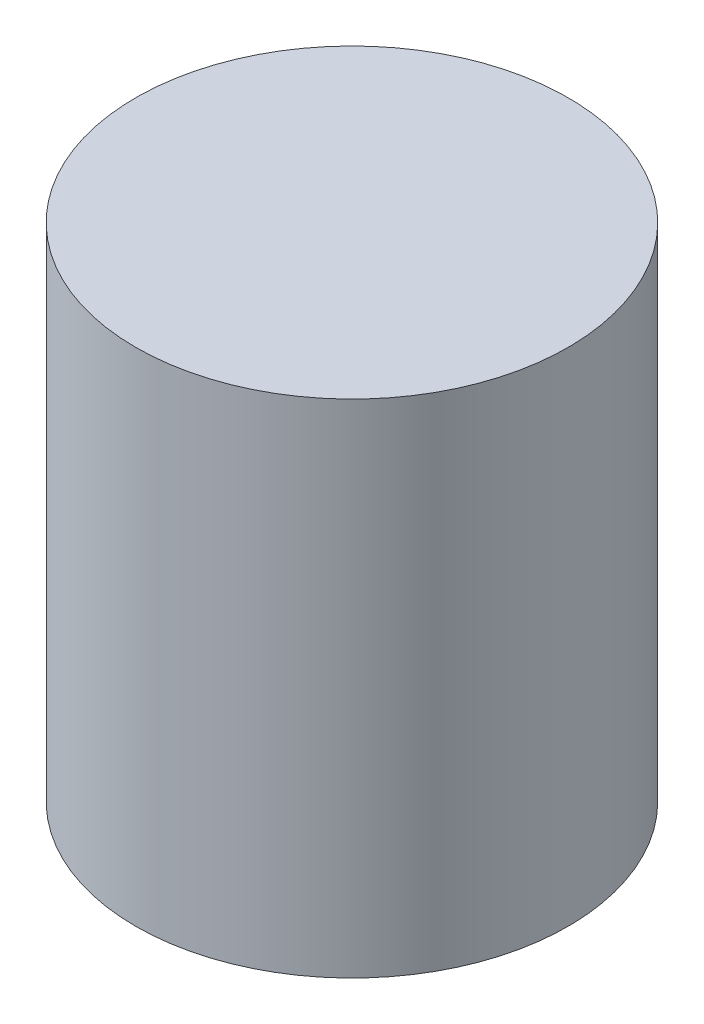
ISO-10303-21;
HEADER;
FILE_DESCRIPTION(('STEP AP214'),'2;1');
FILE_NAME('part.step','',(''),(''),'','','');
FILE_SCHEMA(('AUTOMOTIVE_DESIGN { 1 0 10303 214 1 1 1 1 }'));
ENDSEC;
DATA;
#1=APPLICATION_CONTEXT('core data for automotive mechanical design processes');
#2=APPLICATION_PROTOCOL_DEFINITION('international standard','automotive_design',2000,#1);
#3=PRODUCT_CONTEXT('',#1,'mechanical');
#4=PRODUCT('Part','Part','',(#3));
#5=PRODUCT_RELATED_PRODUCT_CATEGORY('part','',(#4));
#6=PRODUCT_DEFINITION_FORMATION('','',#4);
#7=PRODUCT_DEFINITION_CONTEXT('part definition',#1,'design');
#8=PRODUCT_DEFINITION('design','',#6,#7);
#9=PRODUCT_DEFINITION_SHAPE('','',#8);
#10=(LENGTH_UNIT() NAMED_UNIT(*) SI_UNIT(.MILLI.,.METRE.));
#11=(NAMED_UNIT(*) PLANE_ANGLE_UNIT() SI_UNIT($,.RADIAN.));
#12=(NAMED_UNIT(*) SI_UNIT($,.STERADIAN.) SOLID_ANGLE_UNIT());
#13=UNCERTAINTY_MEASURE_WITH_UNIT(LENGTH_MEASURE(1.E-05),#10,'distance_accuracy_value','');
#14=(GEOMETRIC_REPRESENTATION_CONTEXT(3) GLOBAL_UNCERTAINTY_ASSIGNED_CONTEXT((#13)) GLOBAL_UNIT_ASSIGNED_CONTEXT((#10,
#11,#12)) REPRESENTATION_CONTEXT('',''));
#15=CARTESIAN_POINT('',(0.,0.,0.));
#16=DIRECTION('',(0.,0.,1.));
#17=DIRECTION('',(1.,0.,0.));
#18=AXIS2_PLACEMENT_3D('',#15,#16,#17);
#19=CARTESIAN_POINT('',(0.,16.,0.));
#20=DIRECTION('',(0.,-1.,0.));
#21=DIRECTION('',(0.,0.,-1.));
#22=AXIS2_PLACEMENT_3D('',#19,#20,#21);
#23=CYLINDRICAL_SURFACE('',#22,6.9);
#24=CARTESIAN_POINT('',(0.,16.,0.));
#25=DIRECTION('',(0.,1.,0.));
#26=DIRECTION('',(0.,0.,1.));
#27=AXIS2_PLACEMENT_3D('',#24,#25,#26);
#28=CIRCLE('',#27,6.9);
#29=CARTESIAN_POINT('',(0.,16.,6.9));
#30=VERTEX_POINT('',#29);
#31=EDGE_CURVE('E10',#30,#30,#28,.T.);
#32=ORIENTED_EDGE('',*,*,#31,.F.);
#33=EDGE_LOOP('',(#32));
#34=FACE_BOUND('',#33,.T.);
#35=CARTESIAN_POINT('',(0.,0.,0.));
#36=DIRECTION('',(0.,1.,0.));
#37=DIRECTION('',(0.,0.,1.));
#38=AXIS2_PLACEMENT_3D('',#35,#36,#37);
#39=CIRCLE('',#38,6.9);
#40=CARTESIAN_POINT('',(0.,0.,6.9));
#41=VERTEX_POINT('',#40);
#42=EDGE_CURVE('E37',#41,#41,#39,.T.);
#43=ORIENTED_EDGE('',*,*,#42,.T.);
#44=EDGE_LOOP('',(#43));
#45=FACE_BOUND('',#44,.T.);
#46=ADVANCED_FACE('F34',(#34,#45),#23,.T.);
#47=CARTESIAN_POINT('',(0.,16.,0.));
#48=DIRECTION('',(0.,1.,0.));
#49=DIRECTION('',(0.,0.,1.));
#50=AXIS2_PLACEMENT_3D('',#47,#48,#49);
#51=PLANE('',#50);
#52=ORIENTED_EDGE('',*,*,#31,.T.);
#53=EDGE_LOOP('',(#52));
#54=FACE_BOUND('',#53,.T.);
#55=ADVANCED_FACE('F49',(#54),#51,.T.);
#56=CARTESIAN_POINT('',(0.,0.,0.));
#57=DIRECTION('',(0.,1.,0.));
#58=DIRECTION('',(0.,0.,1.));
#59=AXIS2_PLACEMENT_3D('',#56,#57,#58);
#60=PLANE('',#59);
#61=ORIENTED_EDGE('',*,*,#42,.F.);
#62=EDGE_LOOP('',(#61));
#63=FACE_BOUND('',#62,.T.);
#64=ADVANCED_FACE('F47',(#63),#60,.F.);
#65=CLOSED_SHELL('',(#46,#55,#64));
#66=MANIFOLD_SOLID_BREP('B2',#65);
#67=ADVANCED_BREP_SHAPE_REPRESENTATION('',(#18,#66),#14);
#68=SHAPE_DEFINITION_REPRESENTATION(#9,#67);
ENDSEC;
END-ISO-10303-21;
